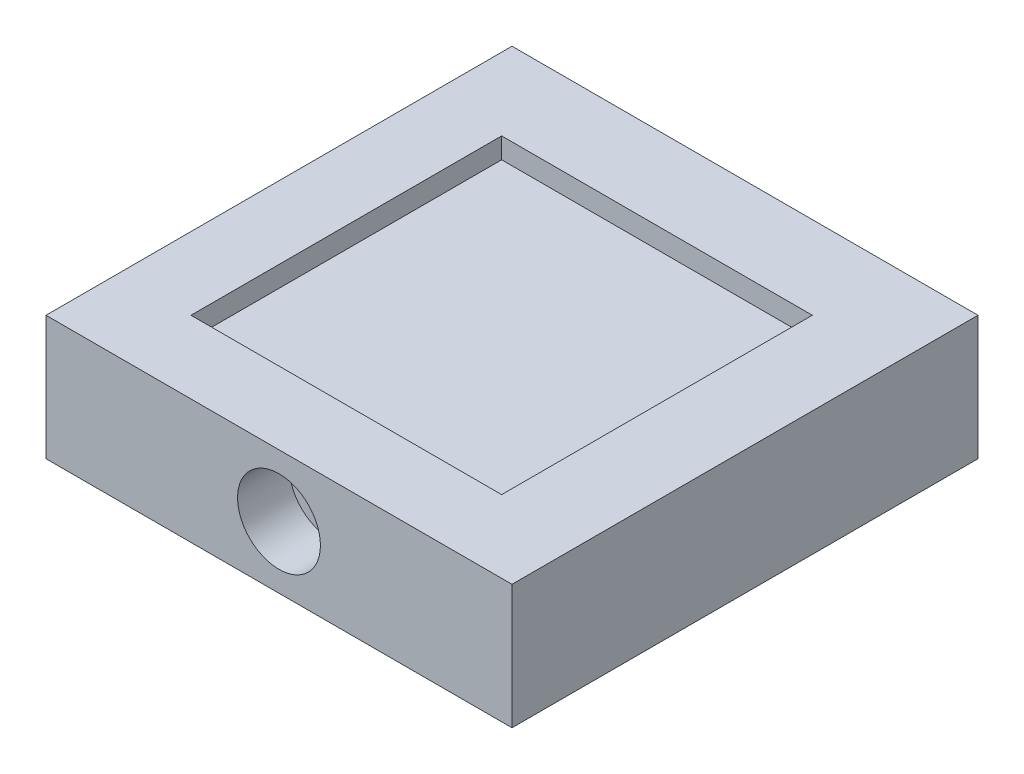
ISO-10303-21;
HEADER;
FILE_DESCRIPTION(('STEP AP214'),'2;1');
FILE_NAME('part.step','',(''),(''),'','','');
FILE_SCHEMA(('AUTOMOTIVE_DESIGN { 1 0 10303 214 1 1 1 1 }'));
ENDSEC;
DATA;
#1=APPLICATION_CONTEXT('core data for automotive mechanical design processes');
#2=APPLICATION_PROTOCOL_DEFINITION('international standard','automotive_design',2000,#1);
#3=PRODUCT_CONTEXT('',#1,'mechanical');
#4=PRODUCT('Part','Part','',(#3));
#5=PRODUCT_RELATED_PRODUCT_CATEGORY('part','',(#4));
#6=PRODUCT_DEFINITION_FORMATION('','',#4);
#7=PRODUCT_DEFINITION_CONTEXT('part definition',#1,'design');
#8=PRODUCT_DEFINITION('design','',#6,#7);
#9=PRODUCT_DEFINITION_SHAPE('','',#8);
#10=(LENGTH_UNIT() NAMED_UNIT(*) SI_UNIT(.MILLI.,.METRE.));
#11=(NAMED_UNIT(*) PLANE_ANGLE_UNIT() SI_UNIT($,.RADIAN.));
#12=(NAMED_UNIT(*) SI_UNIT($,.STERADIAN.) SOLID_ANGLE_UNIT());
#13=UNCERTAINTY_MEASURE_WITH_UNIT(LENGTH_MEASURE(1.E-05),#10,'distance_accuracy_value','');
#14=(GEOMETRIC_REPRESENTATION_CONTEXT(3) GLOBAL_UNCERTAINTY_ASSIGNED_CONTEXT((#13)) GLOBAL_UNIT_ASSIGNED_CONTEXT((#10,
#11,#12)) REPRESENTATION_CONTEXT('',''));
#15=CARTESIAN_POINT('',(0.,0.,0.));
#16=DIRECTION('',(0.,0.,1.));
#17=DIRECTION('',(1.,0.,0.));
#18=AXIS2_PLACEMENT_3D('',#15,#16,#17);
#19=CARTESIAN_POINT('',(0.,12.,0.));
#20=DIRECTION('',(1.,0.,0.));
#21=DIRECTION('',(0.,0.,-1.));
#22=AXIS2_PLACEMENT_3D('',#19,#20,#21);
#23=PLANE('',#22);
#24=CARTESIAN_POINT('',(0.,6.,-22.4778853812341));
#25=DIRECTION('',(-1.,0.,0.));
#26=DIRECTION('',(0.,0.,1.));
#27=AXIS2_PLACEMENT_3D('',#24,#25,#26);
#28=CIRCLE('',#27,4.);
#29=CARTESIAN_POINT('',(0.,6.,-18.4778853812341));
#30=VERTEX_POINT('',#29);
#31=EDGE_CURVE('E157',#30,#30,#28,.T.);
#32=ORIENTED_EDGE('',*,*,#31,.F.);
#33=EDGE_LOOP('',(#32));
#34=FACE_BOUND('',#33,.T.);
#35=DIRECTION('',(0.,0.,1.));
#36=VECTOR('',#35,1.);
#37=CARTESIAN_POINT('',(0.,0.,0.));
#38=LINE('',#37,#36);
#39=CARTESIAN_POINT('',(0.,0.,-45.));
#40=VERTEX_POINT('',#39);
#41=CARTESIAN_POINT('',(0.,0.,0.));
#42=VERTEX_POINT('',#41);
#43=EDGE_CURVE('E175',#40,#42,#38,.T.);
#44=ORIENTED_EDGE('',*,*,#43,.T.);
#45=DIRECTION('',(0.,-1.,0.));
#46=VECTOR('',#45,1.);
#47=CARTESIAN_POINT('',(0.,12.,0.));
#48=LINE('',#47,#46);
#49=CARTESIAN_POINT('',(0.,12.,0.));
#50=VERTEX_POINT('',#49);
#51=EDGE_CURVE('E11',#50,#42,#48,.T.);
#52=ORIENTED_EDGE('',*,*,#51,.F.);
#53=DIRECTION('',(0.,0.,1.));
#54=VECTOR('',#53,1.);
#55=CARTESIAN_POINT('',(0.,12.,0.));
#56=LINE('',#55,#54);
#57=CARTESIAN_POINT('',(0.,12.,-45.));
#58=VERTEX_POINT('',#57);
#59=EDGE_CURVE('E179',#58,#50,#56,.T.);
#60=ORIENTED_EDGE('',*,*,#59,.F.);
#61=DIRECTION('',(0.,-1.,0.));
#62=VECTOR('',#61,1.);
#63=CARTESIAN_POINT('',(0.,12.,-45.));
#64=LINE('',#63,#62);
#65=EDGE_CURVE('E189',#58,#40,#64,.T.);
#66=ORIENTED_EDGE('',*,*,#65,.T.);
#67=EDGE_LOOP('',(#44,#52,#60,#66));
#68=FACE_BOUND('',#67,.T.);
#69=ADVANCED_FACE('F38',(#34,#68),#23,.F.);
#70=CARTESIAN_POINT('',(0.,12.,0.));
#71=DIRECTION('',(0.,0.,-1.));
#72=DIRECTION('',(-1.,0.,0.));
#73=AXIS2_PLACEMENT_3D('',#70,#71,#72);
#74=PLANE('',#73);
#75=CARTESIAN_POINT('',(22.5,6.,0.));
#76=DIRECTION('',(0.,0.,1.));
#77=DIRECTION('',(1.,0.,0.));
#78=AXIS2_PLACEMENT_3D('',#75,#76,#77);
#79=CIRCLE('',#78,4.);
#80=CARTESIAN_POINT('',(26.5,6.,0.));
#81=VERTEX_POINT('',#80);
#82=EDGE_CURVE('E167',#81,#81,#79,.T.);
#83=ORIENTED_EDGE('',*,*,#82,.F.);
#84=EDGE_LOOP('',(#83));
#85=FACE_BOUND('',#84,.T.);
#86=DIRECTION('',(1.,0.,0.));
#87=VECTOR('',#86,1.);
#88=CARTESIAN_POINT('',(0.,0.,0.));
#89=LINE('',#88,#87);
#90=CARTESIAN_POINT('',(45.,0.,0.));
#91=VERTEX_POINT('',#90);
#92=EDGE_CURVE('E193',#42,#91,#89,.T.);
#93=ORIENTED_EDGE('',*,*,#92,.T.);
#94=DIRECTION('',(0.,-1.,0.));
#95=VECTOR('',#94,1.);
#96=CARTESIAN_POINT('',(45.,12.,0.));
#97=LINE('',#96,#95);
#98=CARTESIAN_POINT('',(45.,12.,0.));
#99=VERTEX_POINT('',#98);
#100=EDGE_CURVE('E46',#99,#91,#97,.T.);
#101=ORIENTED_EDGE('',*,*,#100,.F.);
#102=DIRECTION('',(1.,0.,0.));
#103=VECTOR('',#102,1.);
#104=CARTESIAN_POINT('',(0.,12.,0.));
#105=LINE('',#104,#103);
#106=EDGE_CURVE('E90',#50,#99,#105,.T.);
#107=ORIENTED_EDGE('',*,*,#106,.F.);
#108=ORIENTED_EDGE('',*,*,#51,.T.);
#109=EDGE_LOOP('',(#93,#101,#107,#108));
#110=FACE_BOUND('',#109,.T.);
#111=ADVANCED_FACE('F229',(#85,#110),#74,.F.);
#112=CARTESIAN_POINT('',(45.,12.,0.));
#113=DIRECTION('',(-1.,0.,0.));
#114=DIRECTION('',(0.,0.,1.));
#115=AXIS2_PLACEMENT_3D('',#112,#113,#114);
#116=PLANE('',#115);
#117=DIRECTION('',(0.,0.,-1.));
#118=VECTOR('',#117,1.);
#119=CARTESIAN_POINT('',(45.,0.,0.));
#120=LINE('',#119,#118);
#121=CARTESIAN_POINT('',(45.,0.,-45.));
#122=VERTEX_POINT('',#121);
#123=EDGE_CURVE('E196',#91,#122,#120,.T.);
#124=ORIENTED_EDGE('',*,*,#123,.T.);
#125=DIRECTION('',(0.,-1.,0.));
#126=VECTOR('',#125,1.);
#127=CARTESIAN_POINT('',(45.,12.,-45.));
#128=LINE('',#127,#126);
#129=CARTESIAN_POINT('',(45.,12.,-45.));
#130=VERTEX_POINT('',#129);
#131=EDGE_CURVE('E203',#130,#122,#128,.T.);
#132=ORIENTED_EDGE('',*,*,#131,.F.);
#133=DIRECTION('',(0.,0.,-1.));
#134=VECTOR('',#133,1.);
#135=CARTESIAN_POINT('',(45.,12.,0.));
#136=LINE('',#135,#134);
#137=EDGE_CURVE('E184',#99,#130,#136,.T.);
#138=ORIENTED_EDGE('',*,*,#137,.F.);
#139=ORIENTED_EDGE('',*,*,#100,.T.);
#140=EDGE_LOOP('',(#124,#132,#138,#139));
#141=FACE_BOUND('',#140,.T.);
#142=ADVANCED_FACE('F210',(#141),#116,.F.);
#143=CARTESIAN_POINT('',(0.,12.,-45.));
#144=DIRECTION('',(0.,0.,1.));
#145=DIRECTION('',(1.,0.,0.));
#146=AXIS2_PLACEMENT_3D('',#143,#144,#145);
#147=PLANE('',#146);
#148=DIRECTION('',(-1.,0.,0.));
#149=VECTOR('',#148,1.);
#150=CARTESIAN_POINT('',(0.,0.,-45.));
#151=LINE('',#150,#149);
#152=EDGE_CURVE('E83',#122,#40,#151,.T.);
#153=ORIENTED_EDGE('',*,*,#152,.T.);
#154=ORIENTED_EDGE('',*,*,#65,.F.);
#155=DIRECTION('',(-1.,0.,0.));
#156=VECTOR('',#155,1.);
#157=CARTESIAN_POINT('',(0.,12.,-45.));
#158=LINE('',#157,#156);
#159=EDGE_CURVE('E62',#130,#58,#158,.T.);
#160=ORIENTED_EDGE('',*,*,#159,.F.);
#161=ORIENTED_EDGE('',*,*,#131,.T.);
#162=EDGE_LOOP('',(#153,#154,#160,#161));
#163=FACE_BOUND('',#162,.T.);
#164=ADVANCED_FACE('F218',(#163),#147,.F.);
#165=CARTESIAN_POINT('',(0.,12.,0.));
#166=DIRECTION('',(0.,-1.,0.));
#167=DIRECTION('',(0.,0.,-1.));
#168=AXIS2_PLACEMENT_3D('',#165,#166,#167);
#169=PLANE('',#168);
#170=DIRECTION('',(1.,0.,0.));
#171=VECTOR('',#170,1.);
#172=CARTESIAN_POINT('',(7.,12.,-7.));
#173=LINE('',#172,#171);
#174=CARTESIAN_POINT('',(7.,12.,-7.));
#175=VERTEX_POINT('',#174);
#176=CARTESIAN_POINT('',(37.,12.,-7.));
#177=VERTEX_POINT('',#176);
#178=EDGE_CURVE('E148',#175,#177,#173,.T.);
#179=ORIENTED_EDGE('',*,*,#178,.F.);
#180=DIRECTION('',(0.,0.,1.));
#181=VECTOR('',#180,1.);
#182=CARTESIAN_POINT('',(7.,12.,-37.));
#183=LINE('',#182,#181);
#184=CARTESIAN_POINT('',(7.,12.,-37.));
#185=VERTEX_POINT('',#184);
#186=EDGE_CURVE('E53',#185,#175,#183,.T.);
#187=ORIENTED_EDGE('',*,*,#186,.F.);
#188=DIRECTION('',(-1.,0.,0.));
#189=VECTOR('',#188,1.);
#190=CARTESIAN_POINT('',(7.,12.,-37.));
#191=LINE('',#190,#189);
#192=CARTESIAN_POINT('',(37.,12.,-37.));
#193=VERTEX_POINT('',#192);
#194=EDGE_CURVE('E135',#193,#185,#191,.T.);
#195=ORIENTED_EDGE('',*,*,#194,.F.);
#196=DIRECTION('',(0.,0.,-1.));
#197=VECTOR('',#196,1.);
#198=CARTESIAN_POINT('',(37.,12.,-37.));
#199=LINE('',#198,#197);
#200=EDGE_CURVE('E139',#177,#193,#199,.T.);
#201=ORIENTED_EDGE('',*,*,#200,.F.);
#202=EDGE_LOOP('',(#179,#187,#195,#201));
#203=FACE_BOUND('',#202,.T.);
#204=ORIENTED_EDGE('',*,*,#59,.T.);
#205=ORIENTED_EDGE('',*,*,#106,.T.);
#206=ORIENTED_EDGE('',*,*,#137,.T.);
#207=ORIENTED_EDGE('',*,*,#159,.T.);
#208=EDGE_LOOP('',(#204,#205,#206,#207));
#209=FACE_BOUND('',#208,.T.);
#210=ADVANCED_FACE('F220',(#203,#209),#169,.F.);
#211=CARTESIAN_POINT('',(0.,0.,0.));
#212=DIRECTION('',(0.,-1.,0.));
#213=DIRECTION('',(0.,0.,-1.));
#214=AXIS2_PLACEMENT_3D('',#211,#212,#213);
#215=PLANE('',#214);
#216=ORIENTED_EDGE('',*,*,#43,.F.);
#217=ORIENTED_EDGE('',*,*,#152,.F.);
#218=ORIENTED_EDGE('',*,*,#123,.F.);
#219=ORIENTED_EDGE('',*,*,#92,.F.);
#220=EDGE_LOOP('',(#216,#217,#218,#219));
#221=FACE_BOUND('',#220,.T.);
#222=ADVANCED_FACE('F214',(#221),#215,.T.);
#223=CARTESIAN_POINT('',(22.5,6.,-5.));
#224=DIRECTION('',(0.,0.,1.));
#225=DIRECTION('',(1.,0.,0.));
#226=AXIS2_PLACEMENT_3D('',#223,#224,#225);
#227=CYLINDRICAL_SURFACE('',#226,4.);
#228=CARTESIAN_POINT('',(22.5,6.,-5.));
#229=DIRECTION('',(0.,0.,1.));
#230=DIRECTION('',(1.,0.,0.));
#231=AXIS2_PLACEMENT_3D('',#228,#229,#230);
#232=CIRCLE('',#231,4.);
#233=CARTESIAN_POINT('',(26.5,6.,-5.));
#234=VERTEX_POINT('',#233);
#235=EDGE_CURVE('E171',#234,#234,#232,.T.);
#236=ORIENTED_EDGE('',*,*,#235,.F.);
#237=EDGE_LOOP('',(#236));
#238=FACE_BOUND('',#237,.T.);
#239=ORIENTED_EDGE('',*,*,#82,.T.);
#240=EDGE_LOOP('',(#239));
#241=FACE_BOUND('',#240,.T.);
#242=ADVANCED_FACE('F252',(#238,#241),#227,.F.);
#243=CARTESIAN_POINT('',(22.5,6.,-5.));
#244=DIRECTION('',(0.,0.,1.));
#245=DIRECTION('',(1.,0.,0.));
#246=AXIS2_PLACEMENT_3D('',#243,#244,#245);
#247=PLANE('',#246);
#248=ORIENTED_EDGE('',*,*,#235,.T.);
#249=EDGE_LOOP('',(#248));
#250=FACE_BOUND('',#249,.T.);
#251=ADVANCED_FACE('F243',(#250),#247,.T.);
#252=CARTESIAN_POINT('',(5.,6.,-22.4778853812341));
#253=DIRECTION('',(-1.,0.,0.));
#254=DIRECTION('',(0.,0.,1.));
#255=AXIS2_PLACEMENT_3D('',#252,#253,#254);
#256=CYLINDRICAL_SURFACE('',#255,4.);
#257=CARTESIAN_POINT('',(5.,6.,-22.4778853812341));
#258=DIRECTION('',(-1.,0.,0.));
#259=DIRECTION('',(0.,0.,1.));
#260=AXIS2_PLACEMENT_3D('',#257,#258,#259);
#261=CIRCLE('',#260,4.);
#262=CARTESIAN_POINT('',(5.,6.,-18.4778853812341));
#263=VERTEX_POINT('',#262);
#264=EDGE_CURVE('E163',#263,#263,#261,.T.);
#265=ORIENTED_EDGE('',*,*,#264,.F.);
#266=EDGE_LOOP('',(#265));
#267=FACE_BOUND('',#266,.T.);
#268=ORIENTED_EDGE('',*,*,#31,.T.);
#269=EDGE_LOOP('',(#268));
#270=FACE_BOUND('',#269,.T.);
#271=ADVANCED_FACE('F240',(#267,#270),#256,.F.);
#272=CARTESIAN_POINT('',(5.,6.,-22.4778853812341));
#273=DIRECTION('',(-1.,0.,0.));
#274=DIRECTION('',(0.,0.,1.));
#275=AXIS2_PLACEMENT_3D('',#272,#273,#274);
#276=PLANE('',#275);
#277=ORIENTED_EDGE('',*,*,#264,.T.);
#278=EDGE_LOOP('',(#277));
#279=FACE_BOUND('',#278,.T.);
#280=ADVANCED_FACE('F242',(#279),#276,.T.);
#281=CARTESIAN_POINT('',(7.,10.,-37.));
#282=DIRECTION('',(-1.,0.,0.));
#283=DIRECTION('',(0.,0.,1.));
#284=AXIS2_PLACEMENT_3D('',#281,#282,#283);
#285=PLANE('',#284);
#286=ORIENTED_EDGE('',*,*,#186,.T.);
#287=DIRECTION('',(0.,1.,0.));
#288=VECTOR('',#287,1.);
#289=CARTESIAN_POINT('',(7.,10.,-7.));
#290=LINE('',#289,#288);
#291=CARTESIAN_POINT('',(7.,10.,-7.));
#292=VERTEX_POINT('',#291);
#293=EDGE_CURVE('E110',#292,#175,#290,.T.);
#294=ORIENTED_EDGE('',*,*,#293,.F.);
#295=DIRECTION('',(0.,0.,1.));
#296=VECTOR('',#295,1.);
#297=CARTESIAN_POINT('',(7.,10.,-37.));
#298=LINE('',#297,#296);
#299=CARTESIAN_POINT('',(7.,10.,-37.));
#300=VERTEX_POINT('',#299);
#301=EDGE_CURVE('E114',#300,#292,#298,.T.);
#302=ORIENTED_EDGE('',*,*,#301,.F.);
#303=DIRECTION('',(0.,1.,0.));
#304=VECTOR('',#303,1.);
#305=CARTESIAN_POINT('',(7.,10.,-37.));
#306=LINE('',#305,#304);
#307=EDGE_CURVE('E154',#300,#185,#306,.T.);
#308=ORIENTED_EDGE('',*,*,#307,.T.);
#309=EDGE_LOOP('',(#286,#294,#302,#308));
#310=FACE_BOUND('',#309,.T.);
#311=ADVANCED_FACE('F112',(#310),#285,.F.);
#312=CARTESIAN_POINT('',(7.,10.,-37.));
#313=DIRECTION('',(0.,0.,-1.));
#314=DIRECTION('',(-1.,0.,0.));
#315=AXIS2_PLACEMENT_3D('',#312,#313,#314);
#316=PLANE('',#315);
#317=ORIENTED_EDGE('',*,*,#194,.T.);
#318=ORIENTED_EDGE('',*,*,#307,.F.);
#319=DIRECTION('',(-1.,0.,0.));
#320=VECTOR('',#319,1.);
#321=CARTESIAN_POINT('',(7.,10.,-37.));
#322=LINE('',#321,#320);
#323=CARTESIAN_POINT('',(37.,10.,-37.));
#324=VERTEX_POINT('',#323);
#325=EDGE_CURVE('E121',#324,#300,#322,.T.);
#326=ORIENTED_EDGE('',*,*,#325,.F.);
#327=DIRECTION('',(0.,1.,0.));
#328=VECTOR('',#327,1.);
#329=CARTESIAN_POINT('',(37.,10.,-37.));
#330=LINE('',#329,#328);
#331=EDGE_CURVE('E158',#324,#193,#330,.T.);
#332=ORIENTED_EDGE('',*,*,#331,.T.);
#333=EDGE_LOOP('',(#317,#318,#326,#332));
#334=FACE_BOUND('',#333,.T.);
#335=ADVANCED_FACE('F299',(#334),#316,.F.);
#336=CARTESIAN_POINT('',(37.,10.,-37.));
#337=DIRECTION('',(1.,0.,0.));
#338=DIRECTION('',(0.,0.,-1.));
#339=AXIS2_PLACEMENT_3D('',#336,#337,#338);
#340=PLANE('',#339);
#341=ORIENTED_EDGE('',*,*,#200,.T.);
#342=ORIENTED_EDGE('',*,*,#331,.F.);
#343=DIRECTION('',(0.,0.,-1.));
#344=VECTOR('',#343,1.);
#345=CARTESIAN_POINT('',(37.,10.,-37.));
#346=LINE('',#345,#344);
#347=CARTESIAN_POINT('',(37.,10.,-7.));
#348=VERTEX_POINT('',#347);
#349=EDGE_CURVE('E130',#348,#324,#346,.T.);
#350=ORIENTED_EDGE('',*,*,#349,.F.);
#351=DIRECTION('',(0.,1.,0.));
#352=VECTOR('',#351,1.);
#353=CARTESIAN_POINT('',(37.,10.,-7.));
#354=LINE('',#353,#352);
#355=EDGE_CURVE('E120',#348,#177,#354,.T.);
#356=ORIENTED_EDGE('',*,*,#355,.T.);
#357=EDGE_LOOP('',(#341,#342,#350,#356));
#358=FACE_BOUND('',#357,.T.);
#359=ADVANCED_FACE('F307',(#358),#340,.F.);
#360=CARTESIAN_POINT('',(7.,10.,-7.));
#361=DIRECTION('',(0.,0.,1.));
#362=DIRECTION('',(1.,0.,0.));
#363=AXIS2_PLACEMENT_3D('',#360,#361,#362);
#364=PLANE('',#363);
#365=ORIENTED_EDGE('',*,*,#178,.T.);
#366=ORIENTED_EDGE('',*,*,#355,.F.);
#367=DIRECTION('',(1.,0.,0.));
#368=VECTOR('',#367,1.);
#369=CARTESIAN_POINT('',(7.,10.,-7.));
#370=LINE('',#369,#368);
#371=EDGE_CURVE('E124',#292,#348,#370,.T.);
#372=ORIENTED_EDGE('',*,*,#371,.F.);
#373=ORIENTED_EDGE('',*,*,#293,.T.);
#374=EDGE_LOOP('',(#365,#366,#372,#373));
#375=FACE_BOUND('',#374,.T.);
#376=ADVANCED_FACE('F125',(#375),#364,.F.);
#377=CARTESIAN_POINT('',(0.,10.,0.));
#378=DIRECTION('',(0.,1.,0.));
#379=DIRECTION('',(0.,0.,1.));
#380=AXIS2_PLACEMENT_3D('',#377,#378,#379);
#381=PLANE('',#380);
#382=ORIENTED_EDGE('',*,*,#301,.T.);
#383=ORIENTED_EDGE('',*,*,#371,.T.);
#384=ORIENTED_EDGE('',*,*,#349,.T.);
#385=ORIENTED_EDGE('',*,*,#325,.T.);
#386=EDGE_LOOP('',(#382,#383,#384,#385));
#387=FACE_BOUND('',#386,.T.);
#388=ADVANCED_FACE('F132',(#387),#381,.T.);
#389=CLOSED_SHELL('',(#69,#111,#142,#164,#210,#222,#242,#251,#271,#280,#311,#335,#359,#376,#388));
#390=MANIFOLD_SOLID_BREP('B2',#389);
#391=ADVANCED_BREP_SHAPE_REPRESENTATION('',(#18,#390),#14);
#392=SHAPE_DEFINITION_REPRESENTATION(#9,#391);
ENDSEC;
END-ISO-10303-21;
